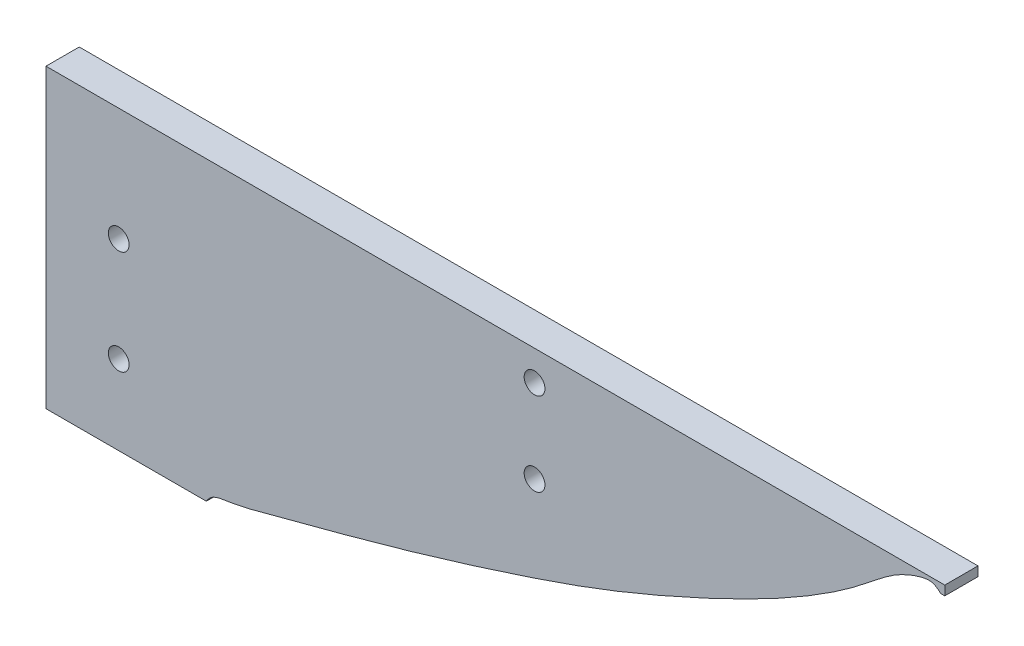
ISO-10303-21;
HEADER;
FILE_DESCRIPTION(('STEP AP214'),'2;1');
FILE_NAME('part.step','',(''),(''),'','','');
FILE_SCHEMA(('AUTOMOTIVE_DESIGN { 1 0 10303 214 1 1 1 1 }'));
ENDSEC;
DATA;
#1=APPLICATION_CONTEXT('core data for automotive mechanical design processes');
#2=APPLICATION_PROTOCOL_DEFINITION('international standard','automotive_design',2000,#1);
#3=PRODUCT_CONTEXT('',#1,'mechanical');
#4=PRODUCT('Part','Part','',(#3));
#5=PRODUCT_RELATED_PRODUCT_CATEGORY('part','',(#4));
#6=PRODUCT_DEFINITION_FORMATION('','',#4);
#7=PRODUCT_DEFINITION_CONTEXT('part definition',#1,'design');
#8=PRODUCT_DEFINITION('design','',#6,#7);
#9=PRODUCT_DEFINITION_SHAPE('','',#8);
#10=(LENGTH_UNIT() NAMED_UNIT(*) SI_UNIT(.MILLI.,.METRE.));
#11=(NAMED_UNIT(*) PLANE_ANGLE_UNIT() SI_UNIT($,.RADIAN.));
#12=(NAMED_UNIT(*) SI_UNIT($,.STERADIAN.) SOLID_ANGLE_UNIT());
#13=UNCERTAINTY_MEASURE_WITH_UNIT(LENGTH_MEASURE(1.E-05),#10,'distance_accuracy_value','');
#14=(GEOMETRIC_REPRESENTATION_CONTEXT(3) GLOBAL_UNCERTAINTY_ASSIGNED_CONTEXT((#13)) GLOBAL_UNIT_ASSIGNED_CONTEXT((#10,
#11,#12)) REPRESENTATION_CONTEXT('',''));
#15=CARTESIAN_POINT('',(0.,0.,0.));
#16=DIRECTION('',(0.,0.,1.));
#17=DIRECTION('',(1.,0.,0.));
#18=AXIS2_PLACEMENT_3D('',#15,#16,#17);
#19=CARTESIAN_POINT('',(12.8301972431439,-41.1850195043994,212.));
#20=DIRECTION('',(0.,0.,-1.));
#21=DIRECTION('',(-1.,0.,0.));
#22=AXIS2_PLACEMENT_3D('',#19,#20,#21);
#23=PLANE('',#22);
#24=CARTESIAN_POINT('',(-100.,-50.,212.));
#25=DIRECTION('',(0.,0.,-1.));
#26=DIRECTION('',(-1.,0.,0.));
#27=AXIS2_PLACEMENT_3D('',#24,#25,#26);
#28=CIRCLE('',#27,2.5);
#29=CARTESIAN_POINT('',(-102.5,-50.,212.));
#30=VERTEX_POINT('',#29);
#31=EDGE_CURVE('E249',#30,#30,#28,.F.);
#32=ORIENTED_EDGE('',*,*,#31,.F.);
#33=EDGE_LOOP('',(#32));
#34=FACE_BOUND('',#33,.T.);
#35=CARTESIAN_POINT('',(0.0705666698621599,-4.96037406111782,212.));
#36=DIRECTION('',(0.,0.,-1.));
#37=DIRECTION('',(-1.,0.,0.));
#38=AXIS2_PLACEMENT_3D('',#35,#36,#37);
#39=CIRCLE('',#38,2.5);
#40=CARTESIAN_POINT('',(-2.42943333013784,-4.96037406111782,212.));
#41=VERTEX_POINT('',#40);
#42=EDGE_CURVE('E159',#41,#41,#39,.F.);
#43=ORIENTED_EDGE('',*,*,#42,.F.);
#44=EDGE_LOOP('',(#43));
#45=FACE_BOUND('',#44,.T.);
#46=DIRECTION('',(0.,1.,0.));
#47=VECTOR('',#46,1.);
#48=CARTESIAN_POINT('',(98.7833447076159,2.25600000000004,212.));
#49=LINE('',#48,#47);
#50=CARTESIAN_POINT('',(98.7833447076159,0.,212.));
#51=VERTEX_POINT('',#50);
#52=CARTESIAN_POINT('',(98.7833447076159,2.25600000000004,212.));
#53=VERTEX_POINT('',#52);
#54=EDGE_CURVE('E211',#51,#53,#49,.T.);
#55=ORIENTED_EDGE('',*,*,#54,.T.);
#56=DIRECTION('',(-1.,0.,0.));
#57=VECTOR('',#56,1.);
#58=CARTESIAN_POINT('',(98.7833447076159,2.25600000000004,212.));
#59=LINE('',#58,#57);
#60=CARTESIAN_POINT('',(-117.498969102243,2.25600000000002,212.));
#61=VERTEX_POINT('',#60);
#62=EDGE_CURVE('E87',#53,#61,#59,.T.);
#63=ORIENTED_EDGE('',*,*,#62,.T.);
#64=DIRECTION('',(0.,-1.,0.));
#65=VECTOR('',#64,1.);
#66=CARTESIAN_POINT('',(-117.498969102243,-69.1381388689775,212.));
#67=LINE('',#66,#65);
#68=CARTESIAN_POINT('',(-117.498969102243,-69.1381388689775,212.));
#69=VERTEX_POINT('',#68);
#70=EDGE_CURVE('E102',#61,#69,#67,.T.);
#71=ORIENTED_EDGE('',*,*,#70,.T.);
#72=CARTESIAN_POINT('',(-78.9133172838508,-69.1229573202233,212.));
#73=CARTESIAN_POINT('',(-91.7752002476471,-69.1306618873553,212.));
#74=CARTESIAN_POINT('',(-104.637084252866,-69.1355442077763,212.));
#75=CARTESIAN_POINT('',(-117.498969102243,-69.1381388689775,212.));
#76=B_SPLINE_CURVE_WITH_KNOTS('',3,(#72,#73,#74,#75),.UNSPECIFIED.,.F.,.F.,(4,4),(0.,1.),.UNSPECIFIED.);
#77=CARTESIAN_POINT('',(-78.9133172838508,-69.1229573202233,212.));
#78=VERTEX_POINT('',#77);
#79=EDGE_CURVE('E94',#69,#78,#76,.F.);
#80=ORIENTED_EDGE('',*,*,#79,.T.);
#81=CARTESIAN_POINT('',(97.751920434082,0.,212.));
#82=CARTESIAN_POINT('',(97.6999655331637,0.118133125010518,212.));
#83=CARTESIAN_POINT('',(97.6119503841002,0.213766524314634,212.));
#84=CARTESIAN_POINT('',(97.4150692120032,0.377646022549959,212.));
#85=CARTESIAN_POINT('',(97.3095290713832,0.449494767643639,212.));
#86=CARTESIAN_POINT('',(96.9942944780989,0.66701076054709,212.));
#87=CARTESIAN_POINT('',(96.7888062895904,0.81944363745508,212.));
#88=CARTESIAN_POINT('',(96.4583426678152,1.01404199123044,212.));
#89=CARTESIAN_POINT('',(96.3462402635352,1.07409316113159,212.));
#90=CARTESIAN_POINT('',(96.1147071199865,1.17608050023469,212.));
#91=CARTESIAN_POINT('',(95.994904072188,1.21709635543821,212.));
#92=CARTESIAN_POINT('',(95.7477939580038,1.28057879071504,212.));
#93=CARTESIAN_POINT('',(95.620454334336,1.30302894538513,212.));
#94=CARTESIAN_POINT('',(95.3676814047567,1.3319260264077,212.));
#95=CARTESIAN_POINT('',(95.2411205749051,1.33872253826099,212.));
#96=CARTESIAN_POINT('',(94.8610648639802,1.3427332156451,212.));
#97=CARTESIAN_POINT('',(94.6062776661609,1.32403825160748,212.));
#98=CARTESIAN_POINT('',(94.1005487630658,1.26357855598431,212.));
#99=CARTESIAN_POINT('',(93.8506199735497,1.22292617445609,212.));
#100=CARTESIAN_POINT('',(93.1082791402229,1.07453501224441,212.));
#101=CARTESIAN_POINT('',(92.6234695594167,0.939805070403311,212.));
#102=CARTESIAN_POINT('',(91.6632381924172,0.637015530639509,212.));
#103=CARTESIAN_POINT('',(91.1880263513538,0.468210560745689,212.));
#104=CARTESIAN_POINT('',(90.2464796166547,0.0990846348270105,212.));
#105=CARTESIAN_POINT('',(89.7812251361114,-0.100331679952828,212.));
#106=CARTESIAN_POINT('',(88.4126321825751,-0.733818658445917,212.));
#107=CARTESIAN_POINT('',(87.532232552315,-1.20645532264821,212.));
#108=CARTESIAN_POINT('',(84.9838649565058,-2.77033909572781,212.));
#109=CARTESIAN_POINT('',(83.4039913617761,-4.00011134691706,212.));
#110=CARTESIAN_POINT('',(81.0559850708342,-5.87905586692521,212.));
#111=CARTESIAN_POINT('',(80.2763319092447,-6.50995016579432,212.));
#112=CARTESIAN_POINT('',(78.7045930139994,-7.75322727057217,212.));
#113=CARTESIAN_POINT('',(77.9139436537229,-8.3677897766072,212.));
#114=CARTESIAN_POINT('',(75.5149216795277,-10.1713978752103,212.));
#115=CARTESIAN_POINT('',(73.8782493985273,-11.3185494478307,212.));
#116=CARTESIAN_POINT('',(70.5545993173826,-13.5383817374102,212.));
#117=CARTESIAN_POINT('',(68.8681898054077,-14.6119037319659,212.));
#118=CARTESIAN_POINT('',(65.4581089186542,-16.7037863222141,212.));
#119=CARTESIAN_POINT('',(63.7341099882695,-17.7216620139302,212.));
#120=CARTESIAN_POINT('',(60.2487903475456,-19.7021632988583,212.));
#121=CARTESIAN_POINT('',(58.4904025986223,-20.6639487053581,212.));
#122=CARTESIAN_POINT('',(54.9498706684662,-22.5416257499812,212.));
#123=CARTESIAN_POINT('',(53.1675510702973,-23.4577529200287,212.));
#124=CARTESIAN_POINT('',(49.5854376107121,-25.2570824029319,212.));
#125=CARTESIAN_POINT('',(47.7863852700977,-26.1397385491859,212.));
#126=CARTESIAN_POINT('',(42.3693335024723,-28.7444296634511,212.));
#127=CARTESIAN_POINT('',(38.7317857889006,-30.424408498442,212.));
#128=CARTESIAN_POINT('',(31.4134736621778,-33.691128051339,212.));
#129=CARTESIAN_POINT('',(27.7320579184264,-35.278190348223,212.));
#130=CARTESIAN_POINT('',(20.3200746190711,-38.3298606088026,212.));
#131=CARTESIAN_POINT('',(16.5868699044954,-39.7917302148168,212.));
#132=CARTESIAN_POINT('',(9.07352458179259,-42.578308793982,212.));
#133=CARTESIAN_POINT('',(5.2930139839976,-43.9045333142439,212.));
#134=CARTESIAN_POINT('',(-2.29837582050949,-46.4715444328892,212.));
#135=CARTESIAN_POINT('',(-6.10835403544352,-47.7155559646697,212.));
#136=CARTESIAN_POINT('',(-13.7421463855894,-50.1561595739221,212.));
#137=CARTESIAN_POINT('',(-17.5672668019848,-51.3501091067607,212.));
#138=CARTESIAN_POINT('',(-25.2362856090639,-53.677839427059,212.));
#139=CARTESIAN_POINT('',(-29.0809724328021,-54.8095396888744,212.));
#140=CARTESIAN_POINT('',(-40.6409371518684,-58.1119877605914,212.));
#141=CARTESIAN_POINT('',(-48.3809101363902,-60.1960115260943,212.));
#142=CARTESIAN_POINT('',(-58.0587577906107,-62.787917600619,212.));
#143=CARTESIAN_POINT('',(-59.9946280057922,-63.3051642143296,212.));
#144=CARTESIAN_POINT('',(-62.9005814124311,-64.0729285629807,212.));
#145=CARTESIAN_POINT('',(-63.8696033204795,-64.3274509409087,212.));
#146=CARTESIAN_POINT('',(-65.8082882219959,-64.8340766273547,212.));
#147=CARTESIAN_POINT('',(-66.7773335142784,-65.0887670129236,212.));
#148=CARTESIAN_POINT('',(-68.7194935978032,-65.5808897250778,212.));
#149=CARTESIAN_POINT('',(-69.6933797749771,-65.815112326634,212.));
#150=CARTESIAN_POINT('',(-71.1648628894952,-66.1214988969119,212.));
#151=CARTESIAN_POINT('',(-71.6570655249976,-66.2164479847939,212.));
#152=CARTESIAN_POINT('',(-72.6451676896849,-66.3905671894051,212.));
#153=CARTESIAN_POINT('',(-73.1416390312044,-66.4673042559124,212.));
#154=CARTESIAN_POINT('',(-74.1363691449745,-66.6131549005462,212.));
#155=CARTESIAN_POINT('',(-74.633805558301,-66.6857758837957,212.));
#156=CARTESIAN_POINT('',(-75.3723636868135,-66.8271068041479,212.));
#157=CARTESIAN_POINT('',(-75.6173280791317,-66.8794275162239,212.));
#158=CARTESIAN_POINT('',(-76.1033877965589,-67.0005707205034,212.));
#159=CARTESIAN_POINT('',(-76.3444641984152,-67.0694739213989,212.));
#160=CARTESIAN_POINT('',(-76.8193212823598,-67.2383969611225,212.));
#161=CARTESIAN_POINT('',(-77.0531694960296,-67.3381287741155,212.));
#162=CARTESIAN_POINT('',(-77.3947935257754,-67.5267444466375,212.));
#163=CARTESIAN_POINT('',(-77.508170730665,-67.5969871759177,212.));
#164=CARTESIAN_POINT('',(-77.7234058999743,-67.7492786376619,212.));
#165=CARTESIAN_POINT('',(-77.8257872280418,-67.8312973649811,212.));
#166=CARTESIAN_POINT('',(-78.0238924270788,-68.0028018375617,212.));
#167=CARTESIAN_POINT('',(-78.1195122062532,-68.0924043324004,212.));
#168=CARTESIAN_POINT('',(-78.3041658123303,-68.2789961400551,212.));
#169=CARTESIAN_POINT('',(-78.3934454615749,-68.3757097380135,212.));
#170=CARTESIAN_POINT('',(-78.5718720914321,-68.569285735348,212.));
#171=CARTESIAN_POINT('',(-78.6600258627944,-68.6669844457833,212.));
#172=CARTESIAN_POINT('',(-78.8170499872101,-68.8772129836647,212.));
#173=CARTESIAN_POINT('',(-78.8856328639249,-68.994510934867,212.));
#174=CARTESIAN_POINT('',(-78.9133172838508,-69.1229573202232,212.));
#175=B_SPLINE_CURVE_WITH_KNOTS('',3,(#81,#82,#83,#84,#85,#86,#87,#88,#89,#90,#91,#92,#93,#94,
#95,#96,#97,#98,#99,#100,#101,#102,#103,#104,#105,#106,#107,#108,#109,#110,#111,#112,#113,#114,
#115,#116,#117,#118,#119,#120,#121,#122,#123,#124,#125,#126,#127,#128,#129,#130,#131,#132,#133,
#134,#135,#136,#137,#138,#139,#140,#141,#142,#143,#144,#145,#146,#147,#148,#149,#150,#151,#152,
#153,#154,#155,#156,#157,#158,#159,#160,#161,#162,#163,#164,#165,#166,#167,#168,#169,#170,#171,
#172,#173,#174),.UNSPECIFIED.,.F.,.F.,(4,2,2,2,2,2,2,2,2,2,2,2,2,2,2,2,2,2,2,2,2,2,2,2,2,2,2,2,
2,2,2,2,2,2,2,2,2,2,2,2,2,2,2,2,2,2,4),(0.,0.00195312500000022,0.00390625000000033,
0.00781250000000067,0.00976562500000078,0.0117187500000009,0.013671875000001,0.015625000000001,
0.019531250000001,0.023437500000001,0.0312500000000009,0.0390625000000008,0.0468750000000007,
0.0625000000000006,0.0937500000000002,0.109375,0.125,0.15625,0.1875,0.21875,0.25,0.28125,0.3125,
0.375,0.4375,0.5,0.5625,0.625,0.6875,0.75,0.875,0.90625,0.921875,0.9375,0.953125,0.9609375,
0.96875,0.9765625,0.98046875,0.984375,0.98828125,0.990234375,0.9921875,0.994140625,0.99609375,
0.998046875,1.),.UNSPECIFIED.);
#176=CARTESIAN_POINT('',(97.751920434082,0.,212.));
#177=VERTEX_POINT('',#176);
#178=EDGE_CURVE('E99',#78,#177,#175,.F.);
#179=ORIENTED_EDGE('',*,*,#178,.T.);
#180=DIRECTION('',(1.,0.,0.));
#181=VECTOR('',#180,1.);
#182=CARTESIAN_POINT('',(97.7519204340817,0.,212.));
#183=LINE('',#182,#181);
#184=EDGE_CURVE('E49',#177,#51,#183,.T.);
#185=ORIENTED_EDGE('',*,*,#184,.T.);
#186=EDGE_LOOP('',(#55,#63,#71,#80,#179,#185));
#187=FACE_BOUND('',#186,.T.);
#188=CARTESIAN_POINT('',(0.0705666698621599,-25.,212.));
#189=DIRECTION('',(0.,0.,-1.));
#190=DIRECTION('',(-1.,0.,0.));
#191=AXIS2_PLACEMENT_3D('',#188,#189,#190);
#192=CIRCLE('',#191,2.5);
#193=CARTESIAN_POINT('',(-2.42943333013784,-25.,212.));
#194=VERTEX_POINT('',#193);
#195=EDGE_CURVE('E256',#194,#194,#192,.F.);
#196=ORIENTED_EDGE('',*,*,#195,.F.);
#197=EDGE_LOOP('',(#196));
#198=FACE_BOUND('',#197,.T.);
#199=CARTESIAN_POINT('',(-100.,-25.,212.));
#200=DIRECTION('',(0.,0.,-1.));
#201=DIRECTION('',(-1.,0.,0.));
#202=AXIS2_PLACEMENT_3D('',#199,#200,#201);
#203=CIRCLE('',#202,2.5);
#204=CARTESIAN_POINT('',(-102.5,-25.,212.));
#205=VERTEX_POINT('',#204);
#206=EDGE_CURVE('E279',#205,#205,#203,.F.);
#207=ORIENTED_EDGE('',*,*,#206,.F.);
#208=EDGE_LOOP('',(#207));
#209=FACE_BOUND('',#208,.T.);
#210=ADVANCED_FACE('F30',(#34,#45,#187,#198,#209),#23,.F.);
#211=CARTESIAN_POINT('',(12.8301972431439,-41.1850195043994,204.));
#212=DIRECTION('',(0.,0.,-1.));
#213=DIRECTION('',(-1.,0.,0.));
#214=AXIS2_PLACEMENT_3D('',#211,#212,#213);
#215=PLANE('',#214);
#216=CARTESIAN_POINT('',(-100.,-50.,204.));
#217=DIRECTION('',(0.,0.,-1.));
#218=DIRECTION('',(-1.,0.,0.));
#219=AXIS2_PLACEMENT_3D('',#216,#217,#218);
#220=CIRCLE('',#219,2.5);
#221=CARTESIAN_POINT('',(-102.5,-50.,204.));
#222=VERTEX_POINT('',#221);
#223=EDGE_CURVE('E278',#222,#222,#220,.F.);
#224=ORIENTED_EDGE('',*,*,#223,.T.);
#225=EDGE_LOOP('',(#224));
#226=FACE_BOUND('',#225,.T.);
#227=CARTESIAN_POINT('',(0.0705666698621599,-4.96037406111782,204.));
#228=DIRECTION('',(0.,0.,-1.));
#229=DIRECTION('',(-1.,0.,0.));
#230=AXIS2_PLACEMENT_3D('',#227,#228,#229);
#231=CIRCLE('',#230,2.5);
#232=CARTESIAN_POINT('',(-2.42943333013784,-4.96037406111782,204.));
#233=VERTEX_POINT('',#232);
#234=EDGE_CURVE('E253',#233,#233,#231,.F.);
#235=ORIENTED_EDGE('',*,*,#234,.T.);
#236=EDGE_LOOP('',(#235));
#237=FACE_BOUND('',#236,.T.);
#238=DIRECTION('',(0.,1.,0.));
#239=VECTOR('',#238,1.);
#240=CARTESIAN_POINT('',(98.7833447076159,2.25600000000004,204.));
#241=LINE('',#240,#239);
#242=CARTESIAN_POINT('',(98.7833447076159,0.,204.));
#243=VERTEX_POINT('',#242);
#244=CARTESIAN_POINT('',(98.7833447076159,2.25600000000004,204.));
#245=VERTEX_POINT('',#244);
#246=EDGE_CURVE('E152',#243,#245,#241,.T.);
#247=ORIENTED_EDGE('',*,*,#246,.F.);
#248=DIRECTION('',(1.,0.,0.));
#249=VECTOR('',#248,1.);
#250=CARTESIAN_POINT('',(97.7519204340817,0.,204.));
#251=LINE('',#250,#249);
#252=CARTESIAN_POINT('',(97.751920434082,0.,204.));
#253=VERTEX_POINT('',#252);
#254=EDGE_CURVE('E79',#253,#243,#251,.T.);
#255=ORIENTED_EDGE('',*,*,#254,.F.);
#256=CARTESIAN_POINT('',(-78.9133172838508,-69.1229573202232,204.));
#257=CARTESIAN_POINT('',(-78.8856328639249,-68.994510934867,204.));
#258=CARTESIAN_POINT('',(-78.8170499872101,-68.8772129836647,204.));
#259=CARTESIAN_POINT('',(-78.6600258627944,-68.6669844457833,204.));
#260=CARTESIAN_POINT('',(-78.5718720914321,-68.569285735348,204.));
#261=CARTESIAN_POINT('',(-78.3934454615749,-68.3757097380135,204.));
#262=CARTESIAN_POINT('',(-78.3041658123303,-68.2789961400551,204.));
#263=CARTESIAN_POINT('',(-78.1195122062532,-68.0924043324004,204.));
#264=CARTESIAN_POINT('',(-78.0238924270788,-68.0028018375617,204.));
#265=CARTESIAN_POINT('',(-77.8257872280418,-67.8312973649811,204.));
#266=CARTESIAN_POINT('',(-77.7234058999743,-67.7492786376619,204.));
#267=CARTESIAN_POINT('',(-77.508170730665,-67.5969871759177,204.));
#268=CARTESIAN_POINT('',(-77.3947935257754,-67.5267444466375,204.));
#269=CARTESIAN_POINT('',(-77.0531694960296,-67.3381287741155,204.));
#270=CARTESIAN_POINT('',(-76.8193212823598,-67.2383969611225,204.));
#271=CARTESIAN_POINT('',(-76.3444641984152,-67.0694739213989,204.));
#272=CARTESIAN_POINT('',(-76.1033877965589,-67.0005707205034,204.));
#273=CARTESIAN_POINT('',(-75.6173280791317,-66.8794275162239,204.));
#274=CARTESIAN_POINT('',(-75.3723636868135,-66.8271068041479,204.));
#275=CARTESIAN_POINT('',(-74.633805558301,-66.6857758837957,204.));
#276=CARTESIAN_POINT('',(-74.1363691449745,-66.6131549005462,204.));
#277=CARTESIAN_POINT('',(-73.1416390312044,-66.4673042559124,204.));
#278=CARTESIAN_POINT('',(-72.6451676896849,-66.3905671894051,204.));
#279=CARTESIAN_POINT('',(-71.6570655249976,-66.2164479847939,204.));
#280=CARTESIAN_POINT('',(-71.1648628894952,-66.1214988969119,204.));
#281=CARTESIAN_POINT('',(-69.6933797749771,-65.815112326634,204.));
#282=CARTESIAN_POINT('',(-68.7194935978032,-65.5808897250778,204.));
#283=CARTESIAN_POINT('',(-66.7773335142784,-65.0887670129236,204.));
#284=CARTESIAN_POINT('',(-65.8082882219959,-64.8340766273547,204.));
#285=CARTESIAN_POINT('',(-63.8696033204795,-64.3274509409087,204.));
#286=CARTESIAN_POINT('',(-62.9005814124311,-64.0729285629807,204.));
#287=CARTESIAN_POINT('',(-59.9946280057922,-63.3051642143296,204.));
#288=CARTESIAN_POINT('',(-58.0587577906107,-62.787917600619,204.));
#289=CARTESIAN_POINT('',(-48.3809101363902,-60.1960115260943,204.));
#290=CARTESIAN_POINT('',(-40.6409371518684,-58.1119877605914,204.));
#291=CARTESIAN_POINT('',(-29.0809724328021,-54.8095396888744,204.));
#292=CARTESIAN_POINT('',(-25.2362856090639,-53.677839427059,204.));
#293=CARTESIAN_POINT('',(-17.5672668019848,-51.3501091067607,204.));
#294=CARTESIAN_POINT('',(-13.7421463855894,-50.1561595739221,204.));
#295=CARTESIAN_POINT('',(-6.10835403544352,-47.7155559646697,204.));
#296=CARTESIAN_POINT('',(-2.29837582050949,-46.4715444328892,204.));
#297=CARTESIAN_POINT('',(5.2930139839976,-43.9045333142439,204.));
#298=CARTESIAN_POINT('',(9.07352458179259,-42.578308793982,204.));
#299=CARTESIAN_POINT('',(16.5868699044954,-39.7917302148168,204.));
#300=CARTESIAN_POINT('',(20.3200746190711,-38.3298606088026,204.));
#301=CARTESIAN_POINT('',(27.7320579184264,-35.278190348223,204.));
#302=CARTESIAN_POINT('',(31.4134736621778,-33.691128051339,204.));
#303=CARTESIAN_POINT('',(38.7317857889006,-30.424408498442,204.));
#304=CARTESIAN_POINT('',(42.3693335024723,-28.7444296634511,204.));
#305=CARTESIAN_POINT('',(47.7863852700977,-26.1397385491859,204.));
#306=CARTESIAN_POINT('',(49.5854376107121,-25.2570824029319,204.));
#307=CARTESIAN_POINT('',(53.1675510702973,-23.4577529200287,204.));
#308=CARTESIAN_POINT('',(54.9498706684662,-22.5416257499812,204.));
#309=CARTESIAN_POINT('',(58.4904025986223,-20.6639487053581,204.));
#310=CARTESIAN_POINT('',(60.2487903475456,-19.7021632988583,204.));
#311=CARTESIAN_POINT('',(63.7341099882695,-17.7216620139302,204.));
#312=CARTESIAN_POINT('',(65.4581089186542,-16.7037863222141,204.));
#313=CARTESIAN_POINT('',(68.8681898054077,-14.6119037319659,204.));
#314=CARTESIAN_POINT('',(70.5545993173826,-13.5383817374102,204.));
#315=CARTESIAN_POINT('',(73.8782493985273,-11.3185494478307,204.));
#316=CARTESIAN_POINT('',(75.5149216795277,-10.1713978752103,204.));
#317=CARTESIAN_POINT('',(77.9139436537229,-8.3677897766072,204.));
#318=CARTESIAN_POINT('',(78.7045930139994,-7.75322727057217,204.));
#319=CARTESIAN_POINT('',(80.2763319092447,-6.50995016579432,204.));
#320=CARTESIAN_POINT('',(81.0559850708342,-5.87905586692521,204.));
#321=CARTESIAN_POINT('',(83.4039913617761,-4.00011134691706,204.));
#322=CARTESIAN_POINT('',(84.9838649565058,-2.77033909572781,204.));
#323=CARTESIAN_POINT('',(87.532232552315,-1.20645532264821,204.));
#324=CARTESIAN_POINT('',(88.4126321825751,-0.733818658445917,204.));
#325=CARTESIAN_POINT('',(89.7812251361114,-0.100331679952828,204.));
#326=CARTESIAN_POINT('',(90.2464796166547,0.0990846348270105,204.));
#327=CARTESIAN_POINT('',(91.1880263513538,0.468210560745689,204.));
#328=CARTESIAN_POINT('',(91.6632381924172,0.637015530639509,204.));
#329=CARTESIAN_POINT('',(92.6234695594167,0.939805070403311,204.));
#330=CARTESIAN_POINT('',(93.1082791402229,1.07453501224441,204.));
#331=CARTESIAN_POINT('',(93.8506199735497,1.22292617445609,204.));
#332=CARTESIAN_POINT('',(94.1005487630658,1.26357855598431,204.));
#333=CARTESIAN_POINT('',(94.6062776661609,1.32403825160748,204.));
#334=CARTESIAN_POINT('',(94.8610648639802,1.3427332156451,204.));
#335=CARTESIAN_POINT('',(95.2411205749051,1.33872253826099,204.));
#336=CARTESIAN_POINT('',(95.3676814047567,1.3319260264077,204.));
#337=CARTESIAN_POINT('',(95.620454334336,1.30302894538513,204.));
#338=CARTESIAN_POINT('',(95.7477939580038,1.28057879071504,204.));
#339=CARTESIAN_POINT('',(95.994904072188,1.21709635543821,204.));
#340=CARTESIAN_POINT('',(96.1147071199865,1.17608050023469,204.));
#341=CARTESIAN_POINT('',(96.3462402635352,1.07409316113159,204.));
#342=CARTESIAN_POINT('',(96.4583426678152,1.01404199123044,204.));
#343=CARTESIAN_POINT('',(96.7888062895904,0.81944363745508,204.));
#344=CARTESIAN_POINT('',(96.9942944780989,0.66701076054709,204.));
#345=CARTESIAN_POINT('',(97.3095290713832,0.449494767643639,204.));
#346=CARTESIAN_POINT('',(97.4150692120032,0.377646022549959,204.));
#347=CARTESIAN_POINT('',(97.6119503841002,0.213766524314634,204.));
#348=CARTESIAN_POINT('',(97.6999655331637,0.118133125010518,204.));
#349=CARTESIAN_POINT('',(97.751920434082,0.,204.));
#350=B_SPLINE_CURVE_WITH_KNOTS('',3,(#256,#257,#258,#259,#260,#261,#262,#263,#264,#265,#266,
#267,#268,#269,#270,#271,#272,#273,#274,#275,#276,#277,#278,#279,#280,#281,#282,#283,#284,#285,
#286,#287,#288,#289,#290,#291,#292,#293,#294,#295,#296,#297,#298,#299,#300,#301,#302,#303,#304,
#305,#306,#307,#308,#309,#310,#311,#312,#313,#314,#315,#316,#317,#318,#319,#320,#321,#322,#323,
#324,#325,#326,#327,#328,#329,#330,#331,#332,#333,#334,#335,#336,#337,#338,#339,#340,#341,#342,
#343,#344,#345,#346,#347,#348,#349),.UNSPECIFIED.,.F.,.F.,(4,2,2,2,2,2,2,2,2,2,2,2,2,2,2,2,2,2,
2,2,2,2,2,2,2,2,2,2,2,2,2,2,2,2,2,2,2,2,2,2,2,2,2,2,2,2,4),(0.,0.001953125,0.00390624999999989,
0.00585937499999989,0.00781249999999978,0.00976562499999978,0.0117187499999998,
0.0156249999999998,0.0195312499999998,0.0234374999999998,0.0312499999999998,0.0390624999999999,
0.0468749999999999,0.0625,0.0781250000000001,0.0937500000000002,0.125,0.25,0.3125,0.375,0.4375,
0.5,0.5625,0.625,0.6875,0.71875,0.75,0.78125,0.8125,0.84375,0.875,0.890625,0.90625,
0.937499999999999,0.953124999999999,0.960937499999999,0.968749999999999,0.976562499999999,
0.980468749999999,0.984374999999999,0.986328124999999,0.988281249999999,0.990234374999999,
0.992187499999999,0.99609375,0.998046875,1.),.UNSPECIFIED.);
#351=CARTESIAN_POINT('',(-78.9133172838508,-69.1229573202233,204.));
#352=VERTEX_POINT('',#351);
#353=EDGE_CURVE('E72',#352,#253,#350,.T.);
#354=ORIENTED_EDGE('',*,*,#353,.F.);
#355=CARTESIAN_POINT('',(-117.498969102243,-69.1381388689775,204.));
#356=CARTESIAN_POINT('',(-104.637084252866,-69.1355442077763,204.));
#357=CARTESIAN_POINT('',(-91.7752002476471,-69.1306618873553,204.));
#358=CARTESIAN_POINT('',(-78.9133172838508,-69.1229573202233,204.));
#359=B_SPLINE_CURVE_WITH_KNOTS('',3,(#355,#356,#357,#358),.UNSPECIFIED.,.F.,.F.,(4,4),(0.,1.),.UNSPECIFIED.);
#360=CARTESIAN_POINT('',(-117.498969102243,-69.1381388689775,204.));
#361=VERTEX_POINT('',#360);
#362=EDGE_CURVE('E112',#361,#352,#359,.T.);
#363=ORIENTED_EDGE('',*,*,#362,.F.);
#364=DIRECTION('',(0.,-1.,0.));
#365=VECTOR('',#364,1.);
#366=CARTESIAN_POINT('',(-117.498969102243,-69.1381388689775,204.));
#367=LINE('',#366,#365);
#368=CARTESIAN_POINT('',(-117.498969102243,2.25600000000002,204.));
#369=VERTEX_POINT('',#368);
#370=EDGE_CURVE('E161',#369,#361,#367,.T.);
#371=ORIENTED_EDGE('',*,*,#370,.F.);
#372=DIRECTION('',(-1.,0.,0.));
#373=VECTOR('',#372,1.);
#374=CARTESIAN_POINT('',(98.7833447076159,2.25600000000004,204.));
#375=LINE('',#374,#373);
#376=EDGE_CURVE('E158',#245,#369,#375,.T.);
#377=ORIENTED_EDGE('',*,*,#376,.F.);
#378=EDGE_LOOP('',(#247,#255,#354,#363,#371,#377));
#379=FACE_BOUND('',#378,.T.);
#380=CARTESIAN_POINT('',(0.0705666698621599,-25.,204.));
#381=DIRECTION('',(0.,0.,-1.));
#382=DIRECTION('',(-1.,0.,0.));
#383=AXIS2_PLACEMENT_3D('',#380,#381,#382);
#384=CIRCLE('',#383,2.5);
#385=CARTESIAN_POINT('',(-2.42943333013784,-25.,204.));
#386=VERTEX_POINT('',#385);
#387=EDGE_CURVE('E276',#386,#386,#384,.F.);
#388=ORIENTED_EDGE('',*,*,#387,.T.);
#389=EDGE_LOOP('',(#388));
#390=FACE_BOUND('',#389,.T.);
#391=CARTESIAN_POINT('',(-100.,-25.,204.));
#392=DIRECTION('',(0.,0.,-1.));
#393=DIRECTION('',(-1.,0.,0.));
#394=AXIS2_PLACEMENT_3D('',#391,#392,#393);
#395=CIRCLE('',#394,2.5);
#396=CARTESIAN_POINT('',(-102.5,-25.,204.));
#397=VERTEX_POINT('',#396);
#398=EDGE_CURVE('E34',#397,#397,#395,.F.);
#399=ORIENTED_EDGE('',*,*,#398,.T.);
#400=EDGE_LOOP('',(#399));
#401=FACE_BOUND('',#400,.T.);
#402=ADVANCED_FACE('F188',(#226,#237,#379,#390,#401),#215,.T.);
#403=CARTESIAN_POINT('',(98.7833447076159,2.25600000000004,212.));
#404=DIRECTION('',(-1.,0.,0.));
#405=DIRECTION('',(0.,0.,1.));
#406=AXIS2_PLACEMENT_3D('',#403,#404,#405);
#407=PLANE('',#406);
#408=ORIENTED_EDGE('',*,*,#246,.T.);
#409=DIRECTION('',(0.,0.,-1.));
#410=VECTOR('',#409,1.);
#411=CARTESIAN_POINT('',(98.7833447076159,2.25600000000004,212.));
#412=LINE('',#411,#410);
#413=EDGE_CURVE('E11',#53,#245,#412,.T.);
#414=ORIENTED_EDGE('',*,*,#413,.F.);
#415=ORIENTED_EDGE('',*,*,#54,.F.);
#416=DIRECTION('',(0.,0.,-1.));
#417=VECTOR('',#416,1.);
#418=CARTESIAN_POINT('',(98.7833447076159,0.,212.));
#419=LINE('',#418,#417);
#420=EDGE_CURVE('E162',#51,#243,#419,.T.);
#421=ORIENTED_EDGE('',*,*,#420,.T.);
#422=EDGE_LOOP('',(#408,#414,#415,#421));
#423=FACE_BOUND('',#422,.T.);
#424=ADVANCED_FACE('F32',(#423),#407,.F.);
#425=CARTESIAN_POINT('',(98.7833447076159,2.25600000000004,212.));
#426=DIRECTION('',(0.,-1.,0.));
#427=DIRECTION('',(1.,0.,0.));
#428=AXIS2_PLACEMENT_3D('',#425,#426,#427);
#429=PLANE('',#428);
#430=ORIENTED_EDGE('',*,*,#376,.T.);
#431=DIRECTION('',(0.,0.,-1.));
#432=VECTOR('',#431,1.);
#433=CARTESIAN_POINT('',(-117.498969102243,2.25600000000002,212.));
#434=LINE('',#433,#432);
#435=EDGE_CURVE('E40',#61,#369,#434,.T.);
#436=ORIENTED_EDGE('',*,*,#435,.F.);
#437=ORIENTED_EDGE('',*,*,#62,.F.);
#438=ORIENTED_EDGE('',*,*,#413,.T.);
#439=EDGE_LOOP('',(#430,#436,#437,#438));
#440=FACE_BOUND('',#439,.T.);
#441=ADVANCED_FACE('F218',(#440),#429,.F.);
#442=CARTESIAN_POINT('',(-117.498969102243,-69.1381388689775,212.));
#443=DIRECTION('',(1.,0.,0.));
#444=DIRECTION('',(0.,1.,0.));
#445=AXIS2_PLACEMENT_3D('',#442,#443,#444);
#446=PLANE('',#445);
#447=ORIENTED_EDGE('',*,*,#370,.T.);
#448=DIRECTION('',(0.,0.,-1.));
#449=VECTOR('',#448,1.);
#450=CARTESIAN_POINT('',(-117.498969102243,-69.1381388689775,212.));
#451=LINE('',#450,#449);
#452=EDGE_CURVE('E114',#69,#361,#451,.T.);
#453=ORIENTED_EDGE('',*,*,#452,.F.);
#454=ORIENTED_EDGE('',*,*,#70,.F.);
#455=ORIENTED_EDGE('',*,*,#435,.T.);
#456=EDGE_LOOP('',(#447,#453,#454,#455));
#457=FACE_BOUND('',#456,.T.);
#458=ADVANCED_FACE('F214',(#457),#446,.F.);
#459=CARTESIAN_POINT('',(-117.498969102243,-69.1381388689775,212.));
#460=CARTESIAN_POINT('',(-104.637084252866,-69.1355442077763,212.));
#461=CARTESIAN_POINT('',(-91.7752002476471,-69.1306618873553,212.));
#462=CARTESIAN_POINT('',(-78.9133172838508,-69.1229573202233,212.));
#463=B_SPLINE_CURVE_WITH_KNOTS('',3,(#459,#460,#461,#462),.UNSPECIFIED.,.F.,.F.,(4,4),(0.,1.),.UNSPECIFIED.);
#464=DIRECTION('',(0.,0.,-1.));
#465=VECTOR('',#464,1.);
#466=SURFACE_OF_LINEAR_EXTRUSION('',#463,#465);
#467=ORIENTED_EDGE('',*,*,#362,.T.);
#468=DIRECTION('',(0.,0.,-1.));
#469=VECTOR('',#468,1.);
#470=CARTESIAN_POINT('',(-78.9133172838508,-69.1229573202233,212.));
#471=LINE('',#470,#469);
#472=EDGE_CURVE('E109',#78,#352,#471,.T.);
#473=ORIENTED_EDGE('',*,*,#472,.F.);
#474=ORIENTED_EDGE('',*,*,#79,.F.);
#475=ORIENTED_EDGE('',*,*,#452,.T.);
#476=EDGE_LOOP('',(#467,#473,#474,#475));
#477=FACE_BOUND('',#476,.T.);
#478=ADVANCED_FACE('F110',(#477),#466,.F.);
#479=CARTESIAN_POINT('',(-78.9133172838508,-69.1229573202232,212.));
#480=CARTESIAN_POINT('',(-78.8856328639249,-68.994510934867,212.));
#481=CARTESIAN_POINT('',(-78.8170499872101,-68.8772129836647,212.));
#482=CARTESIAN_POINT('',(-78.6600258627944,-68.6669844457833,212.));
#483=CARTESIAN_POINT('',(-78.5718720914321,-68.569285735348,212.));
#484=CARTESIAN_POINT('',(-78.3934454615749,-68.3757097380135,212.));
#485=CARTESIAN_POINT('',(-78.3041658123303,-68.2789961400551,212.));
#486=CARTESIAN_POINT('',(-78.1195122062532,-68.0924043324004,212.));
#487=CARTESIAN_POINT('',(-78.0238924270788,-68.0028018375617,212.));
#488=CARTESIAN_POINT('',(-77.8257872280418,-67.8312973649811,212.));
#489=CARTESIAN_POINT('',(-77.7234058999743,-67.7492786376619,212.));
#490=CARTESIAN_POINT('',(-77.508170730665,-67.5969871759177,212.));
#491=CARTESIAN_POINT('',(-77.3947935257754,-67.5267444466375,212.));
#492=CARTESIAN_POINT('',(-77.0531694960296,-67.3381287741155,212.));
#493=CARTESIAN_POINT('',(-76.8193212823598,-67.2383969611225,212.));
#494=CARTESIAN_POINT('',(-76.3444641984152,-67.0694739213989,212.));
#495=CARTESIAN_POINT('',(-76.1033877965589,-67.0005707205034,212.));
#496=CARTESIAN_POINT('',(-75.6173280791317,-66.8794275162239,212.));
#497=CARTESIAN_POINT('',(-75.3723636868135,-66.8271068041479,212.));
#498=CARTESIAN_POINT('',(-74.633805558301,-66.6857758837957,212.));
#499=CARTESIAN_POINT('',(-74.1363691449745,-66.6131549005462,212.));
#500=CARTESIAN_POINT('',(-73.1416390312044,-66.4673042559124,212.));
#501=CARTESIAN_POINT('',(-72.6451676896849,-66.3905671894051,212.));
#502=CARTESIAN_POINT('',(-71.6570655249976,-66.2164479847939,212.));
#503=CARTESIAN_POINT('',(-71.1648628894952,-66.1214988969119,212.));
#504=CARTESIAN_POINT('',(-69.6933797749771,-65.815112326634,212.));
#505=CARTESIAN_POINT('',(-68.7194935978032,-65.5808897250778,212.));
#506=CARTESIAN_POINT('',(-66.7773335142784,-65.0887670129236,212.));
#507=CARTESIAN_POINT('',(-65.8082882219959,-64.8340766273547,212.));
#508=CARTESIAN_POINT('',(-63.8696033204795,-64.3274509409087,212.));
#509=CARTESIAN_POINT('',(-62.9005814124311,-64.0729285629807,212.));
#510=CARTESIAN_POINT('',(-59.9946280057922,-63.3051642143296,212.));
#511=CARTESIAN_POINT('',(-58.0587577906107,-62.787917600619,212.));
#512=CARTESIAN_POINT('',(-48.3809101363902,-60.1960115260943,212.));
#513=CARTESIAN_POINT('',(-40.6409371518684,-58.1119877605914,212.));
#514=CARTESIAN_POINT('',(-29.0809724328021,-54.8095396888744,212.));
#515=CARTESIAN_POINT('',(-25.2362856090639,-53.677839427059,212.));
#516=CARTESIAN_POINT('',(-17.5672668019848,-51.3501091067607,212.));
#517=CARTESIAN_POINT('',(-13.7421463855894,-50.1561595739221,212.));
#518=CARTESIAN_POINT('',(-6.10835403544352,-47.7155559646697,212.));
#519=CARTESIAN_POINT('',(-2.29837582050949,-46.4715444328892,212.));
#520=CARTESIAN_POINT('',(5.2930139839976,-43.9045333142439,212.));
#521=CARTESIAN_POINT('',(9.07352458179259,-42.578308793982,212.));
#522=CARTESIAN_POINT('',(16.5868699044954,-39.7917302148168,212.));
#523=CARTESIAN_POINT('',(20.3200746190711,-38.3298606088026,212.));
#524=CARTESIAN_POINT('',(27.7320579184264,-35.278190348223,212.));
#525=CARTESIAN_POINT('',(31.4134736621778,-33.691128051339,212.));
#526=CARTESIAN_POINT('',(38.7317857889006,-30.424408498442,212.));
#527=CARTESIAN_POINT('',(42.3693335024723,-28.7444296634511,212.));
#528=CARTESIAN_POINT('',(47.7863852700977,-26.1397385491859,212.));
#529=CARTESIAN_POINT('',(49.5854376107121,-25.2570824029319,212.));
#530=CARTESIAN_POINT('',(53.1675510702973,-23.4577529200287,212.));
#531=CARTESIAN_POINT('',(54.9498706684662,-22.5416257499812,212.));
#532=CARTESIAN_POINT('',(58.4904025986223,-20.6639487053581,212.));
#533=CARTESIAN_POINT('',(60.2487903475456,-19.7021632988583,212.));
#534=CARTESIAN_POINT('',(63.7341099882695,-17.7216620139302,212.));
#535=CARTESIAN_POINT('',(65.4581089186542,-16.7037863222141,212.));
#536=CARTESIAN_POINT('',(68.8681898054077,-14.6119037319659,212.));
#537=CARTESIAN_POINT('',(70.5545993173826,-13.5383817374102,212.));
#538=CARTESIAN_POINT('',(73.8782493985273,-11.3185494478307,212.));
#539=CARTESIAN_POINT('',(75.5149216795277,-10.1713978752103,212.));
#540=CARTESIAN_POINT('',(77.9139436537229,-8.3677897766072,212.));
#541=CARTESIAN_POINT('',(78.7045930139994,-7.75322727057217,212.));
#542=CARTESIAN_POINT('',(80.2763319092447,-6.50995016579432,212.));
#543=CARTESIAN_POINT('',(81.0559850708342,-5.87905586692521,212.));
#544=CARTESIAN_POINT('',(83.4039913617761,-4.00011134691706,212.));
#545=CARTESIAN_POINT('',(84.9838649565058,-2.77033909572781,212.));
#546=CARTESIAN_POINT('',(87.532232552315,-1.20645532264821,212.));
#547=CARTESIAN_POINT('',(88.4126321825751,-0.733818658445917,212.));
#548=CARTESIAN_POINT('',(89.7812251361114,-0.100331679952828,212.));
#549=CARTESIAN_POINT('',(90.2464796166547,0.0990846348270105,212.));
#550=CARTESIAN_POINT('',(91.1880263513538,0.468210560745689,212.));
#551=CARTESIAN_POINT('',(91.6632381924172,0.637015530639509,212.));
#552=CARTESIAN_POINT('',(92.6234695594167,0.939805070403311,212.));
#553=CARTESIAN_POINT('',(93.1082791402229,1.07453501224441,212.));
#554=CARTESIAN_POINT('',(93.8506199735497,1.22292617445609,212.));
#555=CARTESIAN_POINT('',(94.1005487630658,1.26357855598431,212.));
#556=CARTESIAN_POINT('',(94.6062776661609,1.32403825160748,212.));
#557=CARTESIAN_POINT('',(94.8610648639802,1.3427332156451,212.));
#558=CARTESIAN_POINT('',(95.2411205749051,1.33872253826099,212.));
#559=CARTESIAN_POINT('',(95.3676814047567,1.3319260264077,212.));
#560=CARTESIAN_POINT('',(95.620454334336,1.30302894538513,212.));
#561=CARTESIAN_POINT('',(95.7477939580038,1.28057879071504,212.));
#562=CARTESIAN_POINT('',(95.994904072188,1.21709635543821,212.));
#563=CARTESIAN_POINT('',(96.1147071199865,1.17608050023469,212.));
#564=CARTESIAN_POINT('',(96.3462402635352,1.07409316113159,212.));
#565=CARTESIAN_POINT('',(96.4583426678152,1.01404199123044,212.));
#566=CARTESIAN_POINT('',(96.7888062895904,0.81944363745508,212.));
#567=CARTESIAN_POINT('',(96.9942944780989,0.66701076054709,212.));
#568=CARTESIAN_POINT('',(97.3095290713832,0.449494767643639,212.));
#569=CARTESIAN_POINT('',(97.4150692120032,0.377646022549959,212.));
#570=CARTESIAN_POINT('',(97.6119503841002,0.213766524314634,212.));
#571=CARTESIAN_POINT('',(97.6999655331637,0.118133125010518,212.));
#572=CARTESIAN_POINT('',(97.751920434082,0.,212.));
#573=B_SPLINE_CURVE_WITH_KNOTS('',3,(#479,#480,#481,#482,#483,#484,#485,#486,#487,#488,#489,
#490,#491,#492,#493,#494,#495,#496,#497,#498,#499,#500,#501,#502,#503,#504,#505,#506,#507,#508,
#509,#510,#511,#512,#513,#514,#515,#516,#517,#518,#519,#520,#521,#522,#523,#524,#525,#526,#527,
#528,#529,#530,#531,#532,#533,#534,#535,#536,#537,#538,#539,#540,#541,#542,#543,#544,#545,#546,
#547,#548,#549,#550,#551,#552,#553,#554,#555,#556,#557,#558,#559,#560,#561,#562,#563,#564,#565,
#566,#567,#568,#569,#570,#571,#572),.UNSPECIFIED.,.F.,.F.,(4,2,2,2,2,2,2,2,2,2,2,2,2,2,2,2,2,2,
2,2,2,2,2,2,2,2,2,2,2,2,2,2,2,2,2,2,2,2,2,2,2,2,2,2,2,2,4),(0.,0.001953125,0.00390624999999989,
0.00585937499999989,0.00781249999999978,0.00976562499999978,0.0117187499999998,
0.0156249999999998,0.0195312499999998,0.0234374999999998,0.0312499999999998,0.0390624999999999,
0.0468749999999999,0.0625,0.0781250000000001,0.0937500000000002,0.125,0.25,0.3125,0.375,0.4375,
0.5,0.5625,0.625,0.6875,0.71875,0.75,0.78125,0.8125,0.84375,0.875,0.890625,0.90625,
0.937499999999999,0.953124999999999,0.960937499999999,0.968749999999999,0.976562499999999,
0.980468749999999,0.984374999999999,0.986328124999999,0.988281249999999,0.990234374999999,
0.992187499999999,0.99609375,0.998046875,1.),.UNSPECIFIED.);
#574=DIRECTION('',(0.,0.,-1.));
#575=VECTOR('',#574,1.);
#576=SURFACE_OF_LINEAR_EXTRUSION('',#573,#575);
#577=ORIENTED_EDGE('',*,*,#353,.T.);
#578=DIRECTION('',(0.,0.,-1.));
#579=VECTOR('',#578,1.);
#580=CARTESIAN_POINT('',(97.751920434082,0.,212.));
#581=LINE('',#580,#579);
#582=EDGE_CURVE('E115',#177,#253,#581,.T.);
#583=ORIENTED_EDGE('',*,*,#582,.F.);
#584=ORIENTED_EDGE('',*,*,#178,.F.);
#585=ORIENTED_EDGE('',*,*,#472,.T.);
#586=EDGE_LOOP('',(#577,#583,#584,#585));
#587=FACE_BOUND('',#586,.T.);
#588=ADVANCED_FACE('F118',(#587),#576,.F.);
#589=CARTESIAN_POINT('',(97.7519204340817,0.,212.));
#590=DIRECTION('',(0.,1.,0.));
#591=DIRECTION('',(-1.,0.,0.));
#592=AXIS2_PLACEMENT_3D('',#589,#590,#591);
#593=PLANE('',#592);
#594=ORIENTED_EDGE('',*,*,#254,.T.);
#595=ORIENTED_EDGE('',*,*,#420,.F.);
#596=ORIENTED_EDGE('',*,*,#184,.F.);
#597=ORIENTED_EDGE('',*,*,#582,.T.);
#598=EDGE_LOOP('',(#594,#595,#596,#597));
#599=FACE_BOUND('',#598,.T.);
#600=ADVANCED_FACE('F138',(#599),#593,.F.);
#601=CARTESIAN_POINT('',(0.0705666698621599,-4.96037406111782,308.));
#602=DIRECTION('',(0.,0.,-1.));
#603=DIRECTION('',(-1.,0.,0.));
#604=AXIS2_PLACEMENT_3D('',#601,#602,#603);
#605=CYLINDRICAL_SURFACE('',#604,2.5);
#606=ORIENTED_EDGE('',*,*,#234,.F.);
#607=EDGE_LOOP('',(#606));
#608=FACE_BOUND('',#607,.T.);
#609=ORIENTED_EDGE('',*,*,#42,.T.);
#610=EDGE_LOOP('',(#609));
#611=FACE_BOUND('',#610,.T.);
#612=ADVANCED_FACE('F236',(#608,#611),#605,.F.);
#613=CARTESIAN_POINT('',(0.0705666698621599,-25.,308.));
#614=DIRECTION('',(0.,0.,-1.));
#615=DIRECTION('',(-1.,0.,0.));
#616=AXIS2_PLACEMENT_3D('',#613,#614,#615);
#617=CYLINDRICAL_SURFACE('',#616,2.5);
#618=ORIENTED_EDGE('',*,*,#387,.F.);
#619=EDGE_LOOP('',(#618));
#620=FACE_BOUND('',#619,.T.);
#621=ORIENTED_EDGE('',*,*,#195,.T.);
#622=EDGE_LOOP('',(#621));
#623=FACE_BOUND('',#622,.T.);
#624=ADVANCED_FACE('F240',(#620,#623),#617,.F.);
#625=CARTESIAN_POINT('',(-100.,-50.,308.));
#626=DIRECTION('',(0.,0.,-1.));
#627=DIRECTION('',(-1.,0.,0.));
#628=AXIS2_PLACEMENT_3D('',#625,#626,#627);
#629=CYLINDRICAL_SURFACE('',#628,2.5);
#630=ORIENTED_EDGE('',*,*,#223,.F.);
#631=EDGE_LOOP('',(#630));
#632=FACE_BOUND('',#631,.T.);
#633=ORIENTED_EDGE('',*,*,#31,.T.);
#634=EDGE_LOOP('',(#633));
#635=FACE_BOUND('',#634,.T.);
#636=ADVANCED_FACE('F290',(#632,#635),#629,.F.);
#637=CARTESIAN_POINT('',(-100.,-25.,308.));
#638=DIRECTION('',(0.,0.,-1.));
#639=DIRECTION('',(-1.,0.,0.));
#640=AXIS2_PLACEMENT_3D('',#637,#638,#639);
#641=CYLINDRICAL_SURFACE('',#640,2.5);
#642=ORIENTED_EDGE('',*,*,#398,.F.);
#643=EDGE_LOOP('',(#642));
#644=FACE_BOUND('',#643,.T.);
#645=ORIENTED_EDGE('',*,*,#206,.T.);
#646=EDGE_LOOP('',(#645));
#647=FACE_BOUND('',#646,.T.);
#648=ADVANCED_FACE('F288',(#644,#647),#641,.F.);
#649=CLOSED_SHELL('',(#210,#402,#424,#441,#458,#478,#588,#600,#612,#624,#636,#648));
#650=MANIFOLD_SOLID_BREP('B2',#649);
#651=ADVANCED_BREP_SHAPE_REPRESENTATION('',(#18,#650),#14);
#652=SHAPE_DEFINITION_REPRESENTATION(#9,#651);
ENDSEC;
END-ISO-10303-21;
